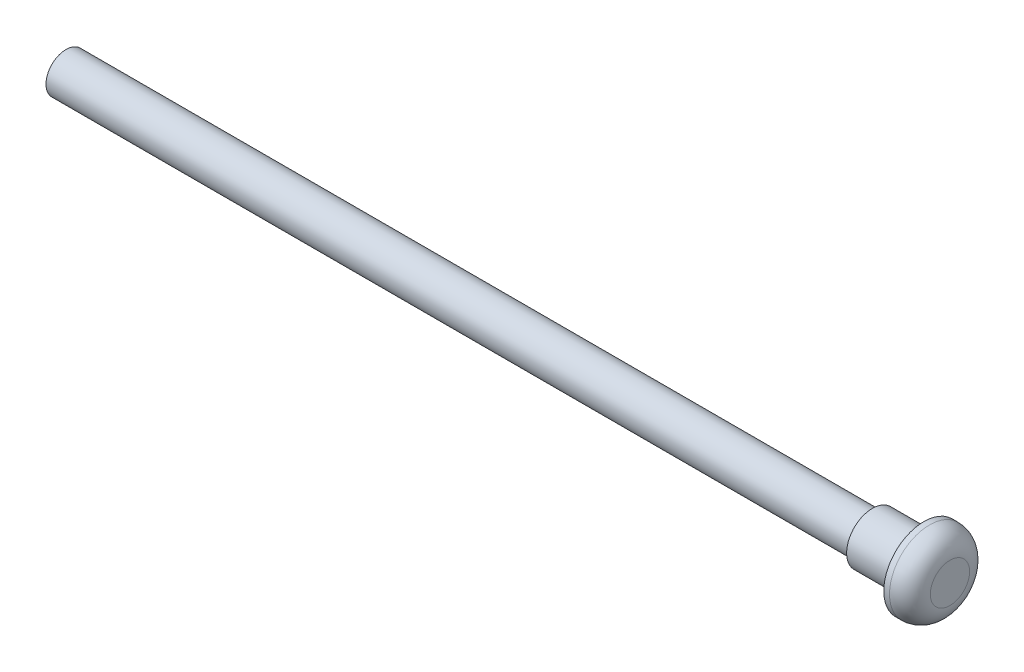
ISO-10303-21;
HEADER;
FILE_DESCRIPTION(('STEP AP214'),'2;1');
FILE_NAME('part.step','',(''),(''),'','','');
FILE_SCHEMA(('AUTOMOTIVE_DESIGN { 1 0 10303 214 1 1 1 1 }'));
ENDSEC;
DATA;
#1=APPLICATION_CONTEXT('core data for automotive mechanical design processes');
#2=APPLICATION_PROTOCOL_DEFINITION('international standard','automotive_design',2000,#1);
#3=PRODUCT_CONTEXT('',#1,'mechanical');
#4=PRODUCT('Part','Part','',(#3));
#5=PRODUCT_RELATED_PRODUCT_CATEGORY('part','',(#4));
#6=PRODUCT_DEFINITION_FORMATION('','',#4);
#7=PRODUCT_DEFINITION_CONTEXT('part definition',#1,'design');
#8=PRODUCT_DEFINITION('design','',#6,#7);
#9=PRODUCT_DEFINITION_SHAPE('','',#8);
#10=(LENGTH_UNIT() NAMED_UNIT(*) SI_UNIT(.MILLI.,.METRE.));
#11=(NAMED_UNIT(*) PLANE_ANGLE_UNIT() SI_UNIT($,.RADIAN.));
#12=(NAMED_UNIT(*) SI_UNIT($,.STERADIAN.) SOLID_ANGLE_UNIT());
#13=UNCERTAINTY_MEASURE_WITH_UNIT(LENGTH_MEASURE(1.E-05),#10,'distance_accuracy_value','');
#14=(GEOMETRIC_REPRESENTATION_CONTEXT(3) GLOBAL_UNCERTAINTY_ASSIGNED_CONTEXT((#13)) GLOBAL_UNIT_ASSIGNED_CONTEXT((#10,
#11,#12)) REPRESENTATION_CONTEXT('',''));
#15=CARTESIAN_POINT('',(0.,0.,0.));
#16=DIRECTION('',(0.,0.,1.));
#17=DIRECTION('',(1.,0.,0.));
#18=AXIS2_PLACEMENT_3D('',#15,#16,#17);
#19=CARTESIAN_POINT('',(0.,0.,0.));
#20=DIRECTION('',(1.,0.,0.));
#21=DIRECTION('',(0.,0.,-1.));
#22=AXIS2_PLACEMENT_3D('',#19,#20,#21);
#23=PLANE('',#22);
#24=CARTESIAN_POINT('',(0.,0.,0.));
#25=DIRECTION('',(-1.,0.,0.));
#26=DIRECTION('',(0.,0.,1.));
#27=AXIS2_PLACEMENT_3D('',#24,#25,#26);
#28=CIRCLE('',#27,3.5);
#29=CARTESIAN_POINT('',(0.,0.,3.5));
#30=VERTEX_POINT('',#29);
#31=EDGE_CURVE('E10',#30,#30,#28,.T.);
#32=ORIENTED_EDGE('',*,*,#31,.T.);
#33=EDGE_LOOP('',(#32));
#34=FACE_BOUND('',#33,.T.);
#35=ADVANCED_FACE('F31',(#34),#23,.F.);
#36=CARTESIAN_POINT('',(0.,0.,0.));
#37=DIRECTION('',(-1.,0.,0.));
#38=DIRECTION('',(0.,0.,1.));
#39=AXIS2_PLACEMENT_3D('',#36,#37,#38);
#40=CYLINDRICAL_SURFACE('',#39,3.5);
#41=ORIENTED_EDGE('',*,*,#31,.F.);
#42=EDGE_LOOP('',(#41));
#43=FACE_BOUND('',#42,.T.);
#44=CARTESIAN_POINT('',(141.,0.,0.));
#45=DIRECTION('',(-1.,0.,0.));
#46=DIRECTION('',(0.,0.,1.));
#47=AXIS2_PLACEMENT_3D('',#44,#45,#46);
#48=CIRCLE('',#47,3.5);
#49=CARTESIAN_POINT('',(141.,0.,3.5));
#50=VERTEX_POINT('',#49);
#51=EDGE_CURVE('E37',#50,#50,#48,.T.);
#52=ORIENTED_EDGE('',*,*,#51,.T.);
#53=EDGE_LOOP('',(#52));
#54=FACE_BOUND('',#53,.T.);
#55=ADVANCED_FACE('F72',(#43,#54),#40,.T.);
#56=CARTESIAN_POINT('',(141.,3.5,0.));
#57=DIRECTION('',(1.,0.,0.));
#58=DIRECTION('',(0.,0.,-1.));
#59=AXIS2_PLACEMENT_3D('',#56,#57,#58);
#60=PLANE('',#59);
#61=ORIENTED_EDGE('',*,*,#51,.F.);
#62=EDGE_LOOP('',(#61));
#63=FACE_BOUND('',#62,.T.);
#64=CARTESIAN_POINT('',(141.,0.,0.));
#65=DIRECTION('',(-1.,0.,0.));
#66=DIRECTION('',(0.,0.,1.));
#67=AXIS2_PLACEMENT_3D('',#64,#65,#66);
#68=CIRCLE('',#67,4.5);
#69=CARTESIAN_POINT('',(141.,0.,4.5));
#70=VERTEX_POINT('',#69);
#71=EDGE_CURVE('E41',#70,#70,#68,.T.);
#72=ORIENTED_EDGE('',*,*,#71,.T.);
#73=EDGE_LOOP('',(#72));
#74=FACE_BOUND('',#73,.T.);
#75=ADVANCED_FACE('F76',(#63,#74),#60,.F.);
#76=CARTESIAN_POINT('',(0.,0.,0.));
#77=DIRECTION('',(-1.,0.,0.));
#78=DIRECTION('',(0.,0.,1.));
#79=AXIS2_PLACEMENT_3D('',#76,#77,#78);
#80=CYLINDRICAL_SURFACE('',#79,4.5);
#81=ORIENTED_EDGE('',*,*,#71,.F.);
#82=EDGE_LOOP('',(#81));
#83=FACE_BOUND('',#82,.T.);
#84=CARTESIAN_POINT('',(150.,0.,0.));
#85=DIRECTION('',(-1.,0.,0.));
#86=DIRECTION('',(0.,0.,1.));
#87=AXIS2_PLACEMENT_3D('',#84,#85,#86);
#88=CIRCLE('',#87,4.5);
#89=CARTESIAN_POINT('',(150.,0.,4.5));
#90=VERTEX_POINT('',#89);
#91=EDGE_CURVE('E45',#90,#90,#88,.T.);
#92=ORIENTED_EDGE('',*,*,#91,.T.);
#93=EDGE_LOOP('',(#92));
#94=FACE_BOUND('',#93,.T.);
#95=ADVANCED_FACE('F81',(#83,#94),#80,.T.);
#96=CARTESIAN_POINT('',(150.,4.5,0.));
#97=DIRECTION('',(1.,0.,0.));
#98=DIRECTION('',(0.,0.,-1.));
#99=AXIS2_PLACEMENT_3D('',#96,#97,#98);
#100=PLANE('',#99);
#101=ORIENTED_EDGE('',*,*,#91,.F.);
#102=EDGE_LOOP('',(#101));
#103=FACE_BOUND('',#102,.T.);
#104=CARTESIAN_POINT('',(150.,0.,0.));
#105=DIRECTION('',(-1.,0.,0.));
#106=DIRECTION('',(0.,0.,1.));
#107=AXIS2_PLACEMENT_3D('',#104,#105,#106);
#108=CIRCLE('',#107,7.);
#109=CARTESIAN_POINT('',(150.,0.,7.));
#110=VERTEX_POINT('',#109);
#111=EDGE_CURVE('E50',#110,#110,#108,.T.);
#112=ORIENTED_EDGE('',*,*,#111,.T.);
#113=EDGE_LOOP('',(#112));
#114=FACE_BOUND('',#113,.T.);
#115=ADVANCED_FACE('F87',(#103,#114),#100,.F.);
#116=CARTESIAN_POINT('',(0.,0.,0.));
#117=DIRECTION('',(-1.,0.,0.));
#118=DIRECTION('',(0.,0.,1.));
#119=AXIS2_PLACEMENT_3D('',#116,#117,#118);
#120=CYLINDRICAL_SURFACE('',#119,7.);
#121=ORIENTED_EDGE('',*,*,#111,.F.);
#122=EDGE_LOOP('',(#121));
#123=FACE_BOUND('',#122,.T.);
#124=CARTESIAN_POINT('',(151.,0.,0.));
#125=DIRECTION('',(-1.,0.,0.));
#126=DIRECTION('',(0.,0.,1.));
#127=AXIS2_PLACEMENT_3D('',#124,#125,#126);
#128=CIRCLE('',#127,7.);
#129=CARTESIAN_POINT('',(151.,0.,7.));
#130=VERTEX_POINT('',#129);
#131=EDGE_CURVE('E53',#130,#130,#128,.T.);
#132=ORIENTED_EDGE('',*,*,#131,.T.);
#133=EDGE_LOOP('',(#132));
#134=FACE_BOUND('',#133,.T.);
#135=ADVANCED_FACE('F68',(#123,#134),#120,.T.);
#136=CARTESIAN_POINT('',(151.,0.,0.));
#137=DIRECTION('',(-1.,0.,0.));
#138=DIRECTION('',(0.,0.,1.));
#139=AXIS2_PLACEMENT_3D('',#136,#137,#138);
#140=DEGENERATE_TOROIDAL_SURFACE('',#139,3.42857142857144,3.57142857142856,.T.);
#141=ORIENTED_EDGE('',*,*,#131,.F.);
#142=EDGE_LOOP('',(#141));
#143=FACE_BOUND('',#142,.T.);
#144=CARTESIAN_POINT('',(154.571428571429,0.,0.));
#145=DIRECTION('',(-1.,0.,0.));
#146=DIRECTION('',(0.,0.,1.));
#147=AXIS2_PLACEMENT_3D('',#144,#145,#146);
#148=CIRCLE('',#147,3.42857142857145);
#149=CARTESIAN_POINT('',(154.571428571429,0.,3.42857142857145));
#150=VERTEX_POINT('',#149);
#151=EDGE_CURVE('E56',#150,#150,#148,.T.);
#152=ORIENTED_EDGE('',*,*,#151,.T.);
#153=EDGE_LOOP('',(#152));
#154=FACE_BOUND('',#153,.T.);
#155=ADVANCED_FACE('F60',(#143,#154),#140,.T.);
#156=CARTESIAN_POINT('',(154.571428571429,3.42857142857145,0.));
#157=DIRECTION('',(-1.,0.,0.));
#158=DIRECTION('',(0.,0.,1.));
#159=AXIS2_PLACEMENT_3D('',#156,#157,#158);
#160=PLANE('',#159);
#161=ORIENTED_EDGE('',*,*,#151,.F.);
#162=EDGE_LOOP('',(#161));
#163=FACE_BOUND('',#162,.T.);
#164=ADVANCED_FACE('F62',(#163),#160,.F.);
#165=CLOSED_SHELL('',(#35,#55,#75,#95,#115,#135,#155,#164));
#166=MANIFOLD_SOLID_BREP('B2',#165);
#167=ADVANCED_BREP_SHAPE_REPRESENTATION('',(#18,#166),#14);
#168=SHAPE_DEFINITION_REPRESENTATION(#9,#167);
ENDSEC;
END-ISO-10303-21;
